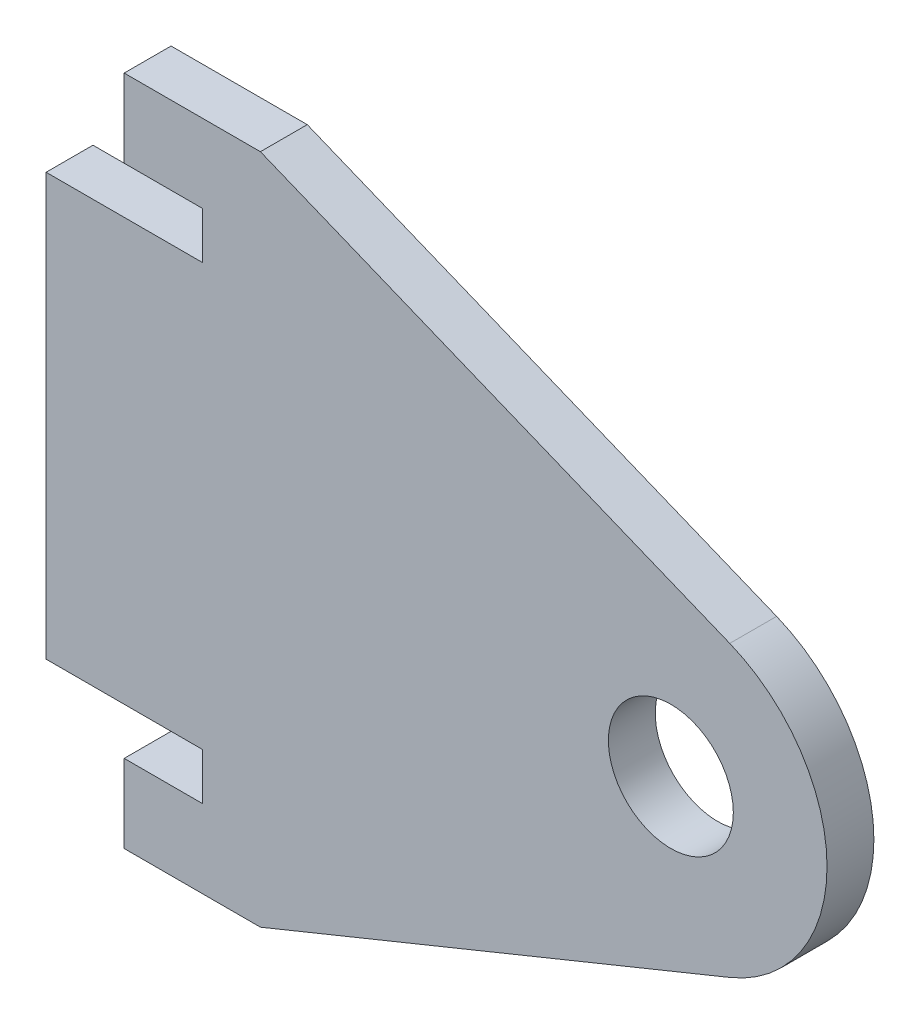
ISO-10303-21;
HEADER;
FILE_DESCRIPTION(('STEP AP214'),'2;1');
FILE_NAME('part.step','',(''),(''),'','','');
FILE_SCHEMA(('AUTOMOTIVE_DESIGN { 1 0 10303 214 1 1 1 1 }'));
ENDSEC;
DATA;
#1=APPLICATION_CONTEXT('core data for automotive mechanical design processes');
#2=APPLICATION_PROTOCOL_DEFINITION('international standard','automotive_design',2000,#1);
#3=PRODUCT_CONTEXT('',#1,'mechanical');
#4=PRODUCT('Part','Part','',(#3));
#5=PRODUCT_RELATED_PRODUCT_CATEGORY('part','',(#4));
#6=PRODUCT_DEFINITION_FORMATION('','',#4);
#7=PRODUCT_DEFINITION_CONTEXT('part definition',#1,'design');
#8=PRODUCT_DEFINITION('design','',#6,#7);
#9=PRODUCT_DEFINITION_SHAPE('','',#8);
#10=(LENGTH_UNIT() NAMED_UNIT(*) SI_UNIT(.MILLI.,.METRE.));
#11=(NAMED_UNIT(*) PLANE_ANGLE_UNIT() SI_UNIT($,.RADIAN.));
#12=(NAMED_UNIT(*) SI_UNIT($,.STERADIAN.) SOLID_ANGLE_UNIT());
#13=UNCERTAINTY_MEASURE_WITH_UNIT(LENGTH_MEASURE(1.E-05),#10,'distance_accuracy_value','');
#14=(GEOMETRIC_REPRESENTATION_CONTEXT(3) GLOBAL_UNCERTAINTY_ASSIGNED_CONTEXT((#13)) GLOBAL_UNIT_ASSIGNED_CONTEXT((#10,
#11,#12)) REPRESENTATION_CONTEXT('',''));
#15=CARTESIAN_POINT('',(0.,0.,0.));
#16=DIRECTION('',(0.,0.,1.));
#17=DIRECTION('',(1.,0.,0.));
#18=AXIS2_PLACEMENT_3D('',#15,#16,#17);
#19=CARTESIAN_POINT('',(28.3384615384615,9.98461538461537,3.));
#20=DIRECTION('',(0.,0.,-1.));
#21=DIRECTION('',(-1.,0.,0.));
#22=AXIS2_PLACEMENT_3D('',#19,#20,#21);
#23=PLANE('',#22);
#24=DIRECTION('',(-1.,0.,0.));
#25=VECTOR('',#24,1.);
#26=CARTESIAN_POINT('',(-11.6615384615385,31.4846153846154,3.));
#27=LINE('',#26,#25);
#28=CARTESIAN_POINT('',(2.05930364072528,31.4846153846154,3.));
#29=VERTEX_POINT('',#28);
#30=CARTESIAN_POINT('',(-6.66153846153847,31.4846153846154,3.));
#31=VERTEX_POINT('',#30);
#32=EDGE_CURVE('E155',#29,#31,#27,.T.);
#33=ORIENTED_EDGE('',*,*,#32,.T.);
#34=DIRECTION('',(0.,1.,0.));
#35=VECTOR('',#34,1.);
#36=CARTESIAN_POINT('',(-6.66153846153847,35.1218574890826,3.));
#37=LINE('',#36,#35);
#38=CARTESIAN_POINT('',(-6.66153846153847,26.4846153846154,3.));
#39=VERTEX_POINT('',#38);
#40=EDGE_CURVE('E63',#39,#31,#37,.T.);
#41=ORIENTED_EDGE('',*,*,#40,.F.);
#42=DIRECTION('',(1.,0.,0.));
#43=VECTOR('',#42,1.);
#44=CARTESIAN_POINT('',(-11.6615384615385,26.4846153846154,3.));
#45=LINE('',#44,#43);
#46=CARTESIAN_POINT('',(-1.66153846153847,26.4846153846154,3.));
#47=VERTEX_POINT('',#46);
#48=EDGE_CURVE('E152',#39,#47,#45,.T.);
#49=ORIENTED_EDGE('',*,*,#48,.T.);
#50=DIRECTION('',(0.,-1.,0.));
#51=VECTOR('',#50,1.);
#52=CARTESIAN_POINT('',(-1.66153846153847,26.4846153846154,3.));
#53=LINE('',#52,#51);
#54=CARTESIAN_POINT('',(-1.66153846153847,23.4846153846154,3.));
#55=VERTEX_POINT('',#54);
#56=EDGE_CURVE('E160',#47,#55,#53,.T.);
#57=ORIENTED_EDGE('',*,*,#56,.T.);
#58=DIRECTION('',(-1.,0.,0.));
#59=VECTOR('',#58,1.);
#60=CARTESIAN_POINT('',(-11.6615384615385,23.4846153846154,3.));
#61=LINE('',#60,#59);
#62=CARTESIAN_POINT('',(-11.6615384615385,23.4846153846154,3.));
#63=VERTEX_POINT('',#62);
#64=EDGE_CURVE('E165',#55,#63,#61,.T.);
#65=ORIENTED_EDGE('',*,*,#64,.T.);
#66=DIRECTION('',(0.,-1.,0.));
#67=VECTOR('',#66,1.);
#68=CARTESIAN_POINT('',(-11.6615384615385,23.4846153846154,3.));
#69=LINE('',#68,#67);
#70=CARTESIAN_POINT('',(-11.6615384615385,-3.51538461538463,3.));
#71=VERTEX_POINT('',#70);
#72=EDGE_CURVE('E176',#63,#71,#69,.T.);
#73=ORIENTED_EDGE('',*,*,#72,.T.);
#74=DIRECTION('',(1.,0.,0.));
#75=VECTOR('',#74,1.);
#76=CARTESIAN_POINT('',(-11.6615384615385,-3.51538461538463,3.));
#77=LINE('',#76,#75);
#78=CARTESIAN_POINT('',(-1.66153846153847,-3.51538461538463,3.));
#79=VERTEX_POINT('',#78);
#80=EDGE_CURVE('E179',#71,#79,#77,.T.);
#81=ORIENTED_EDGE('',*,*,#80,.T.);
#82=DIRECTION('',(0.,-1.,0.));
#83=VECTOR('',#82,1.);
#84=CARTESIAN_POINT('',(-1.66153846153847,-3.51538461538463,3.));
#85=LINE('',#84,#83);
#86=CARTESIAN_POINT('',(-1.66153846153847,-6.51538461538463,3.));
#87=VERTEX_POINT('',#86);
#88=EDGE_CURVE('E182',#79,#87,#85,.T.);
#89=ORIENTED_EDGE('',*,*,#88,.T.);
#90=DIRECTION('',(-1.,0.,0.));
#91=VECTOR('',#90,1.);
#92=CARTESIAN_POINT('',(-11.6615384615385,-6.51538461538463,3.));
#93=LINE('',#92,#91);
#94=CARTESIAN_POINT('',(-6.66153846153847,-6.51538461538463,3.));
#95=VERTEX_POINT('',#94);
#96=EDGE_CURVE('E185',#87,#95,#93,.T.);
#97=ORIENTED_EDGE('',*,*,#96,.T.);
#98=DIRECTION('',(0.,1.,0.));
#99=VECTOR('',#98,1.);
#100=CARTESIAN_POINT('',(-6.66153846153847,-15.1526267198519,3.));
#101=LINE('',#100,#99);
#102=CARTESIAN_POINT('',(-6.66153846153847,-11.5153846153846,3.));
#103=VERTEX_POINT('',#102);
#104=EDGE_CURVE('E414',#103,#95,#101,.T.);
#105=ORIENTED_EDGE('',*,*,#104,.F.);
#106=DIRECTION('',(1.,0.,0.));
#107=VECTOR('',#106,1.);
#108=CARTESIAN_POINT('',(-11.6615384615385,-11.5153846153846,3.));
#109=LINE('',#108,#107);
#110=CARTESIAN_POINT('',(2.05930364072528,-11.5153846153846,3.));
#111=VERTEX_POINT('',#110);
#112=EDGE_CURVE('E189',#103,#111,#109,.T.);
#113=ORIENTED_EDGE('',*,*,#112,.T.);
#114=DIRECTION('',(0.926139546237743,0.377181045248231,0.));
#115=VECTOR('',#114,1.);
#116=CARTESIAN_POINT('',(32.1102719909438,0.723219922237943,3.));
#117=LINE('',#116,#115);
#118=CARTESIAN_POINT('',(32.1102719909438,0.723219922237946,3.));
#119=VERTEX_POINT('',#118);
#120=EDGE_CURVE('E192',#111,#119,#117,.T.);
#121=ORIENTED_EDGE('',*,*,#120,.T.);
#122=CARTESIAN_POINT('',(28.3384615384615,9.98461538461537,3.));
#123=DIRECTION('',(0.,0.,1.));
#124=DIRECTION('',(-1.,0.,0.));
#125=AXIS2_PLACEMENT_3D('',#122,#123,#124);
#126=CIRCLE('',#125,10.);
#127=CARTESIAN_POINT('',(32.1102719909438,19.2460108469928,3.));
#128=VERTEX_POINT('',#127);
#129=EDGE_CURVE('E195',#119,#128,#126,.T.);
#130=ORIENTED_EDGE('',*,*,#129,.T.);
#131=DIRECTION('',(-0.926139546237743,0.377181045248231,0.));
#132=VECTOR('',#131,1.);
#133=CARTESIAN_POINT('',(2.05930364072528,31.4846153846154,3.));
#134=LINE('',#133,#132);
#135=EDGE_CURVE('E198',#128,#29,#134,.T.);
#136=ORIENTED_EDGE('',*,*,#135,.T.);
#137=EDGE_LOOP('',(#33,#41,#49,#57,#65,#73,#81,#89,#97,#105,#113,#121,#130,#136));
#138=FACE_BOUND('',#137,.T.);
#139=CARTESIAN_POINT('',(28.3384615384615,9.98461538461537,3.));
#140=DIRECTION('',(0.,0.,1.));
#141=DIRECTION('',(1.,0.,0.));
#142=AXIS2_PLACEMENT_3D('',#139,#140,#141);
#143=CIRCLE('',#142,4.);
#144=CARTESIAN_POINT('',(32.3384615384615,9.98461538461537,3.));
#145=VERTEX_POINT('',#144);
#146=EDGE_CURVE('E208',#145,#145,#143,.T.);
#147=ORIENTED_EDGE('',*,*,#146,.F.);
#148=EDGE_LOOP('',(#147));
#149=FACE_BOUND('',#148,.T.);
#150=ADVANCED_FACE('F39',(#138,#149),#23,.F.);
#151=CARTESIAN_POINT('',(28.3384615384615,9.98461538461537,0.));
#152=DIRECTION('',(0.,0.,-1.));
#153=DIRECTION('',(-1.,0.,0.));
#154=AXIS2_PLACEMENT_3D('',#151,#152,#153);
#155=PLANE('',#154);
#156=DIRECTION('',(0.,1.,0.));
#157=VECTOR('',#156,1.);
#158=CARTESIAN_POINT('',(-6.66153846153847,35.1218574890826,0.));
#159=LINE('',#158,#157);
#160=CARTESIAN_POINT('',(-6.66153846153847,26.4846153846154,0.));
#161=VERTEX_POINT('',#160);
#162=CARTESIAN_POINT('',(-6.66153846153847,31.4846153846154,0.));
#163=VERTEX_POINT('',#162);
#164=EDGE_CURVE('E142',#161,#163,#159,.T.);
#165=ORIENTED_EDGE('',*,*,#164,.T.);
#166=DIRECTION('',(-1.,0.,0.));
#167=VECTOR('',#166,1.);
#168=CARTESIAN_POINT('',(-11.6615384615385,31.4846153846154,0.));
#169=LINE('',#168,#167);
#170=CARTESIAN_POINT('',(2.05930364072528,31.4846153846154,0.));
#171=VERTEX_POINT('',#170);
#172=EDGE_CURVE('E161',#171,#163,#169,.T.);
#173=ORIENTED_EDGE('',*,*,#172,.F.);
#174=DIRECTION('',(-0.926139546237743,0.377181045248231,0.));
#175=VECTOR('',#174,1.);
#176=CARTESIAN_POINT('',(2.05930364072528,31.4846153846154,0.));
#177=LINE('',#176,#175);
#178=CARTESIAN_POINT('',(32.1102719909438,19.2460108469928,0.));
#179=VERTEX_POINT('',#178);
#180=EDGE_CURVE('E168',#179,#171,#177,.T.);
#181=ORIENTED_EDGE('',*,*,#180,.F.);
#182=CARTESIAN_POINT('',(28.3384615384615,9.98461538461537,0.));
#183=DIRECTION('',(0.,0.,1.));
#184=DIRECTION('',(-1.,0.,0.));
#185=AXIS2_PLACEMENT_3D('',#182,#183,#184);
#186=CIRCLE('',#185,10.);
#187=CARTESIAN_POINT('',(32.1102719909438,0.723219922237946,0.));
#188=VERTEX_POINT('',#187);
#189=EDGE_CURVE('E233',#188,#179,#186,.T.);
#190=ORIENTED_EDGE('',*,*,#189,.F.);
#191=DIRECTION('',(0.926139546237743,0.377181045248231,0.));
#192=VECTOR('',#191,1.);
#193=CARTESIAN_POINT('',(32.1102719909438,0.723219922237943,0.));
#194=LINE('',#193,#192);
#195=CARTESIAN_POINT('',(2.05930364072528,-11.5153846153846,0.));
#196=VERTEX_POINT('',#195);
#197=EDGE_CURVE('E230',#196,#188,#194,.T.);
#198=ORIENTED_EDGE('',*,*,#197,.F.);
#199=DIRECTION('',(1.,0.,0.));
#200=VECTOR('',#199,1.);
#201=CARTESIAN_POINT('',(-11.6615384615385,-11.5153846153846,0.));
#202=LINE('',#201,#200);
#203=CARTESIAN_POINT('',(-6.66153846153847,-11.5153846153846,0.));
#204=VERTEX_POINT('',#203);
#205=EDGE_CURVE('E227',#204,#196,#202,.T.);
#206=ORIENTED_EDGE('',*,*,#205,.F.);
#207=DIRECTION('',(0.,1.,0.));
#208=VECTOR('',#207,1.);
#209=CARTESIAN_POINT('',(-6.66153846153847,-15.1526267198519,0.));
#210=LINE('',#209,#208);
#211=CARTESIAN_POINT('',(-6.66153846153847,-6.51538461538463,0.));
#212=VERTEX_POINT('',#211);
#213=EDGE_CURVE('E55',#204,#212,#210,.T.);
#214=ORIENTED_EDGE('',*,*,#213,.T.);
#215=DIRECTION('',(-1.,0.,0.));
#216=VECTOR('',#215,1.);
#217=CARTESIAN_POINT('',(-11.6615384615385,-6.51538461538463,0.));
#218=LINE('',#217,#216);
#219=CARTESIAN_POINT('',(-1.66153846153847,-6.51538461538463,0.));
#220=VERTEX_POINT('',#219);
#221=EDGE_CURVE('E223',#220,#212,#218,.T.);
#222=ORIENTED_EDGE('',*,*,#221,.F.);
#223=DIRECTION('',(0.,-1.,0.));
#224=VECTOR('',#223,1.);
#225=CARTESIAN_POINT('',(-1.66153846153847,-3.51538461538463,0.));
#226=LINE('',#225,#224);
#227=CARTESIAN_POINT('',(-1.66153846153847,-3.51538461538463,0.));
#228=VERTEX_POINT('',#227);
#229=EDGE_CURVE('E220',#228,#220,#226,.T.);
#230=ORIENTED_EDGE('',*,*,#229,.F.);
#231=DIRECTION('',(1.,0.,0.));
#232=VECTOR('',#231,1.);
#233=CARTESIAN_POINT('',(-11.6615384615385,-3.51538461538463,0.));
#234=LINE('',#233,#232);
#235=CARTESIAN_POINT('',(-11.6615384615385,-3.51538461538463,0.));
#236=VERTEX_POINT('',#235);
#237=EDGE_CURVE('E217',#236,#228,#234,.T.);
#238=ORIENTED_EDGE('',*,*,#237,.F.);
#239=DIRECTION('',(0.,-1.,0.));
#240=VECTOR('',#239,1.);
#241=CARTESIAN_POINT('',(-11.6615384615385,23.4846153846154,0.));
#242=LINE('',#241,#240);
#243=CARTESIAN_POINT('',(-11.6615384615385,23.4846153846154,0.));
#244=VERTEX_POINT('',#243);
#245=EDGE_CURVE('E214',#244,#236,#242,.T.);
#246=ORIENTED_EDGE('',*,*,#245,.F.);
#247=DIRECTION('',(-1.,0.,0.));
#248=VECTOR('',#247,1.);
#249=CARTESIAN_POINT('',(-11.6615384615385,23.4846153846154,0.));
#250=LINE('',#249,#248);
#251=CARTESIAN_POINT('',(-1.66153846153847,23.4846153846154,0.));
#252=VERTEX_POINT('',#251);
#253=EDGE_CURVE('E211',#252,#244,#250,.T.);
#254=ORIENTED_EDGE('',*,*,#253,.F.);
#255=DIRECTION('',(0.,-1.,0.));
#256=VECTOR('',#255,1.);
#257=CARTESIAN_POINT('',(-1.66153846153847,26.4846153846154,0.));
#258=LINE('',#257,#256);
#259=CARTESIAN_POINT('',(-1.66153846153847,26.4846153846154,0.));
#260=VERTEX_POINT('',#259);
#261=EDGE_CURVE('E207',#260,#252,#258,.T.);
#262=ORIENTED_EDGE('',*,*,#261,.F.);
#263=DIRECTION('',(1.,0.,0.));
#264=VECTOR('',#263,1.);
#265=CARTESIAN_POINT('',(-11.6615384615385,26.4846153846154,0.));
#266=LINE('',#265,#264);
#267=EDGE_CURVE('E204',#161,#260,#266,.T.);
#268=ORIENTED_EDGE('',*,*,#267,.F.);
#269=EDGE_LOOP('',(#165,#173,#181,#190,#198,#206,#214,#222,#230,#238,#246,#254,#262,#268));
#270=FACE_BOUND('',#269,.T.);
#271=CARTESIAN_POINT('',(28.3384615384615,9.98461538461537,0.));
#272=DIRECTION('',(0.,0.,1.));
#273=DIRECTION('',(1.,0.,0.));
#274=AXIS2_PLACEMENT_3D('',#271,#272,#273);
#275=CIRCLE('',#274,4.);
#276=CARTESIAN_POINT('',(32.3384615384615,9.98461538461537,0.));
#277=VERTEX_POINT('',#276);
#278=EDGE_CURVE('E171',#277,#277,#275,.T.);
#279=ORIENTED_EDGE('',*,*,#278,.T.);
#280=EDGE_LOOP('',(#279));
#281=FACE_BOUND('',#280,.T.);
#282=ADVANCED_FACE('F280',(#270,#281),#155,.T.);
#283=CARTESIAN_POINT('',(-11.6615384615385,26.4846153846154,3.));
#284=DIRECTION('',(0.,1.,0.));
#285=DIRECTION('',(0.,0.,1.));
#286=AXIS2_PLACEMENT_3D('',#283,#284,#285);
#287=PLANE('',#286);
#288=ORIENTED_EDGE('',*,*,#48,.F.);
#289=DIRECTION('',(0.,0.,1.));
#290=VECTOR('',#289,1.);
#291=CARTESIAN_POINT('',(-6.66153846153847,26.4846153846154,-0.00100000000000013));
#292=LINE('',#291,#290);
#293=EDGE_CURVE('E139',#161,#39,#292,.T.);
#294=ORIENTED_EDGE('',*,*,#293,.F.);
#295=ORIENTED_EDGE('',*,*,#267,.T.);
#296=DIRECTION('',(0.,0.,-1.));
#297=VECTOR('',#296,1.);
#298=CARTESIAN_POINT('',(-1.66153846153847,26.4846153846154,3.));
#299=LINE('',#298,#297);
#300=EDGE_CURVE('E11',#47,#260,#299,.T.);
#301=ORIENTED_EDGE('',*,*,#300,.F.);
#302=EDGE_LOOP('',(#288,#294,#295,#301));
#303=FACE_BOUND('',#302,.T.);
#304=ADVANCED_FACE('F41',(#303),#287,.F.);
#305=CARTESIAN_POINT('',(-1.66153846153847,26.4846153846154,3.));
#306=DIRECTION('',(1.,0.,0.));
#307=DIRECTION('',(0.,1.,0.));
#308=AXIS2_PLACEMENT_3D('',#305,#306,#307);
#309=PLANE('',#308);
#310=ORIENTED_EDGE('',*,*,#261,.T.);
#311=DIRECTION('',(0.,0.,-1.));
#312=VECTOR('',#311,1.);
#313=CARTESIAN_POINT('',(-1.66153846153847,23.4846153846154,3.));
#314=LINE('',#313,#312);
#315=EDGE_CURVE('E48',#55,#252,#314,.T.);
#316=ORIENTED_EDGE('',*,*,#315,.F.);
#317=ORIENTED_EDGE('',*,*,#56,.F.);
#318=ORIENTED_EDGE('',*,*,#300,.T.);
#319=EDGE_LOOP('',(#310,#316,#317,#318));
#320=FACE_BOUND('',#319,.T.);
#321=ADVANCED_FACE('F294',(#320),#309,.F.);
#322=CARTESIAN_POINT('',(-11.6615384615385,23.4846153846154,3.));
#323=DIRECTION('',(0.,-1.,0.));
#324=DIRECTION('',(0.,0.,-1.));
#325=AXIS2_PLACEMENT_3D('',#322,#323,#324);
#326=PLANE('',#325);
#327=ORIENTED_EDGE('',*,*,#253,.T.);
#328=DIRECTION('',(0.,0.,-1.));
#329=VECTOR('',#328,1.);
#330=CARTESIAN_POINT('',(-11.6615384615385,23.4846153846154,3.));
#331=LINE('',#330,#329);
#332=EDGE_CURVE('E265',#63,#244,#331,.T.);
#333=ORIENTED_EDGE('',*,*,#332,.F.);
#334=ORIENTED_EDGE('',*,*,#64,.F.);
#335=ORIENTED_EDGE('',*,*,#315,.T.);
#336=EDGE_LOOP('',(#327,#333,#334,#335));
#337=FACE_BOUND('',#336,.T.);
#338=ADVANCED_FACE('F274',(#337),#326,.F.);
#339=CARTESIAN_POINT('',(-11.6615384615385,23.4846153846154,3.));
#340=DIRECTION('',(1.,0.,0.));
#341=DIRECTION('',(0.,1.,0.));
#342=AXIS2_PLACEMENT_3D('',#339,#340,#341);
#343=PLANE('',#342);
#344=ORIENTED_EDGE('',*,*,#245,.T.);
#345=DIRECTION('',(0.,0.,-1.));
#346=VECTOR('',#345,1.);
#347=CARTESIAN_POINT('',(-11.6615384615385,-3.51538461538463,3.));
#348=LINE('',#347,#346);
#349=EDGE_CURVE('E261',#71,#236,#348,.T.);
#350=ORIENTED_EDGE('',*,*,#349,.F.);
#351=ORIENTED_EDGE('',*,*,#72,.F.);
#352=ORIENTED_EDGE('',*,*,#332,.T.);
#353=EDGE_LOOP('',(#344,#350,#351,#352));
#354=FACE_BOUND('',#353,.T.);
#355=ADVANCED_FACE('F286',(#354),#343,.F.);
#356=CARTESIAN_POINT('',(-11.6615384615385,-3.51538461538463,3.));
#357=DIRECTION('',(0.,1.,0.));
#358=DIRECTION('',(-1.,0.,0.));
#359=AXIS2_PLACEMENT_3D('',#356,#357,#358);
#360=PLANE('',#359);
#361=ORIENTED_EDGE('',*,*,#237,.T.);
#362=DIRECTION('',(0.,0.,-1.));
#363=VECTOR('',#362,1.);
#364=CARTESIAN_POINT('',(-1.66153846153847,-3.51538461538463,3.));
#365=LINE('',#364,#363);
#366=EDGE_CURVE('E257',#79,#228,#365,.T.);
#367=ORIENTED_EDGE('',*,*,#366,.F.);
#368=ORIENTED_EDGE('',*,*,#80,.F.);
#369=ORIENTED_EDGE('',*,*,#349,.T.);
#370=EDGE_LOOP('',(#361,#367,#368,#369));
#371=FACE_BOUND('',#370,.T.);
#372=ADVANCED_FACE('F290',(#371),#360,.F.);
#373=CARTESIAN_POINT('',(-1.66153846153847,-3.51538461538463,3.));
#374=DIRECTION('',(1.,0.,0.));
#375=DIRECTION('',(0.,1.,0.));
#376=AXIS2_PLACEMENT_3D('',#373,#374,#375);
#377=PLANE('',#376);
#378=ORIENTED_EDGE('',*,*,#229,.T.);
#379=DIRECTION('',(0.,0.,-1.));
#380=VECTOR('',#379,1.);
#381=CARTESIAN_POINT('',(-1.66153846153847,-6.51538461538463,3.));
#382=LINE('',#381,#380);
#383=EDGE_CURVE('E253',#87,#220,#382,.T.);
#384=ORIENTED_EDGE('',*,*,#383,.F.);
#385=ORIENTED_EDGE('',*,*,#88,.F.);
#386=ORIENTED_EDGE('',*,*,#366,.T.);
#387=EDGE_LOOP('',(#378,#384,#385,#386));
#388=FACE_BOUND('',#387,.T.);
#389=ADVANCED_FACE('F336',(#388),#377,.F.);
#390=CARTESIAN_POINT('',(-11.6615384615385,-6.51538461538463,3.));
#391=DIRECTION('',(0.,-1.,0.));
#392=DIRECTION('',(1.,0.,0.));
#393=AXIS2_PLACEMENT_3D('',#390,#391,#392);
#394=PLANE('',#393);
#395=ORIENTED_EDGE('',*,*,#221,.T.);
#396=DIRECTION('',(0.,0.,-1.));
#397=VECTOR('',#396,1.);
#398=CARTESIAN_POINT('',(-6.66153846153847,-6.51538461538463,-0.00100000000000013));
#399=LINE('',#398,#397);
#400=EDGE_CURVE('E412',#95,#212,#399,.T.);
#401=ORIENTED_EDGE('',*,*,#400,.F.);
#402=ORIENTED_EDGE('',*,*,#96,.F.);
#403=ORIENTED_EDGE('',*,*,#383,.T.);
#404=EDGE_LOOP('',(#395,#401,#402,#403));
#405=FACE_BOUND('',#404,.T.);
#406=ADVANCED_FACE('F332',(#405),#394,.F.);
#407=CARTESIAN_POINT('',(-11.6615384615385,-11.5153846153846,3.));
#408=DIRECTION('',(0.,1.,0.));
#409=DIRECTION('',(0.,0.,1.));
#410=AXIS2_PLACEMENT_3D('',#407,#408,#409);
#411=PLANE('',#410);
#412=ORIENTED_EDGE('',*,*,#112,.F.);
#413=DIRECTION('',(0.,0.,1.));
#414=VECTOR('',#413,1.);
#415=CARTESIAN_POINT('',(-6.66153846153847,-11.5153846153846,-0.00100000000000013));
#416=LINE('',#415,#414);
#417=EDGE_CURVE('E417',#204,#103,#416,.T.);
#418=ORIENTED_EDGE('',*,*,#417,.F.);
#419=ORIENTED_EDGE('',*,*,#205,.T.);
#420=DIRECTION('',(0.,0.,-1.));
#421=VECTOR('',#420,1.);
#422=CARTESIAN_POINT('',(2.05930364072528,-11.5153846153846,3.));
#423=LINE('',#422,#421);
#424=EDGE_CURVE('E249',#111,#196,#423,.T.);
#425=ORIENTED_EDGE('',*,*,#424,.F.);
#426=EDGE_LOOP('',(#412,#418,#419,#425));
#427=FACE_BOUND('',#426,.T.);
#428=ADVANCED_FACE('F328',(#427),#411,.F.);
#429=CARTESIAN_POINT('',(32.1102719909438,0.723219922237943,3.));
#430=DIRECTION('',(-0.377181045248231,0.926139546237743,0.));
#431=DIRECTION('',(-0.926139546237743,-0.377181045248231,0.));
#432=AXIS2_PLACEMENT_3D('',#429,#430,#431);
#433=PLANE('',#432);
#434=ORIENTED_EDGE('',*,*,#197,.T.);
#435=DIRECTION('',(0.,0.,-1.));
#436=VECTOR('',#435,1.);
#437=CARTESIAN_POINT('',(32.1102719909438,0.723219922237946,3.));
#438=LINE('',#437,#436);
#439=EDGE_CURVE('E245',#119,#188,#438,.T.);
#440=ORIENTED_EDGE('',*,*,#439,.F.);
#441=ORIENTED_EDGE('',*,*,#120,.F.);
#442=ORIENTED_EDGE('',*,*,#424,.T.);
#443=EDGE_LOOP('',(#434,#440,#441,#442));
#444=FACE_BOUND('',#443,.T.);
#445=ADVANCED_FACE('F324',(#444),#433,.F.);
#446=CARTESIAN_POINT('',(28.3384615384615,9.98461538461537,3.));
#447=DIRECTION('',(0.,0.,-1.));
#448=DIRECTION('',(-1.,0.,0.));
#449=AXIS2_PLACEMENT_3D('',#446,#447,#448);
#450=CYLINDRICAL_SURFACE('',#449,10.);
#451=ORIENTED_EDGE('',*,*,#189,.T.);
#452=DIRECTION('',(0.,0.,-1.));
#453=VECTOR('',#452,1.);
#454=CARTESIAN_POINT('',(32.1102719909438,19.2460108469928,3.));
#455=LINE('',#454,#453);
#456=EDGE_CURVE('E241',#128,#179,#455,.T.);
#457=ORIENTED_EDGE('',*,*,#456,.F.);
#458=ORIENTED_EDGE('',*,*,#129,.F.);
#459=ORIENTED_EDGE('',*,*,#439,.T.);
#460=EDGE_LOOP('',(#451,#457,#458,#459));
#461=FACE_BOUND('',#460,.T.);
#462=ADVANCED_FACE('F320',(#461),#450,.T.);
#463=CARTESIAN_POINT('',(2.05930364072528,31.4846153846154,3.));
#464=DIRECTION('',(-0.377181045248231,-0.926139546237743,0.));
#465=DIRECTION('',(0.926139546237743,-0.377181045248231,0.));
#466=AXIS2_PLACEMENT_3D('',#463,#464,#465);
#467=PLANE('',#466);
#468=ORIENTED_EDGE('',*,*,#180,.T.);
#469=DIRECTION('',(0.,0.,-1.));
#470=VECTOR('',#469,1.);
#471=CARTESIAN_POINT('',(2.05930364072528,31.4846153846154,3.));
#472=LINE('',#471,#470);
#473=EDGE_CURVE('E203',#29,#171,#472,.T.);
#474=ORIENTED_EDGE('',*,*,#473,.F.);
#475=ORIENTED_EDGE('',*,*,#135,.F.);
#476=ORIENTED_EDGE('',*,*,#456,.T.);
#477=EDGE_LOOP('',(#468,#474,#475,#476));
#478=FACE_BOUND('',#477,.T.);
#479=ADVANCED_FACE('F316',(#478),#467,.F.);
#480=CARTESIAN_POINT('',(-11.6615384615385,31.4846153846154,3.));
#481=DIRECTION('',(0.,-1.,0.));
#482=DIRECTION('',(0.,0.,-1.));
#483=AXIS2_PLACEMENT_3D('',#480,#481,#482);
#484=PLANE('',#483);
#485=ORIENTED_EDGE('',*,*,#172,.T.);
#486=DIRECTION('',(0.,0.,-1.));
#487=VECTOR('',#486,1.);
#488=CARTESIAN_POINT('',(-6.66153846153847,31.4846153846154,-0.00100000000000013));
#489=LINE('',#488,#487);
#490=EDGE_CURVE('E147',#31,#163,#489,.T.);
#491=ORIENTED_EDGE('',*,*,#490,.F.);
#492=ORIENTED_EDGE('',*,*,#32,.F.);
#493=ORIENTED_EDGE('',*,*,#473,.T.);
#494=EDGE_LOOP('',(#485,#491,#492,#493));
#495=FACE_BOUND('',#494,.T.);
#496=ADVANCED_FACE('F313',(#495),#484,.F.);
#497=CARTESIAN_POINT('',(28.3384615384615,9.98461538461537,3.));
#498=DIRECTION('',(0.,0.,-1.));
#499=DIRECTION('',(-1.,0.,0.));
#500=AXIS2_PLACEMENT_3D('',#497,#498,#499);
#501=CYLINDRICAL_SURFACE('',#500,4.);
#502=ORIENTED_EDGE('',*,*,#146,.T.);
#503=EDGE_LOOP('',(#502));
#504=FACE_BOUND('',#503,.T.);
#505=ORIENTED_EDGE('',*,*,#278,.F.);
#506=EDGE_LOOP('',(#505));
#507=FACE_BOUND('',#506,.T.);
#508=ADVANCED_FACE('F310',(#504,#507),#501,.F.);
#509=CARTESIAN_POINT('',(-6.66153846153847,35.1218574890826,-0.00100000000000013));
#510=DIRECTION('',(1.,0.,0.));
#511=DIRECTION('',(0.,1.,0.));
#512=AXIS2_PLACEMENT_3D('',#509,#510,#511);
#513=PLANE('',#512);
#514=ORIENTED_EDGE('',*,*,#293,.T.);
#515=ORIENTED_EDGE('',*,*,#40,.T.);
#516=ORIENTED_EDGE('',*,*,#490,.T.);
#517=ORIENTED_EDGE('',*,*,#164,.F.);
#518=EDGE_LOOP('',(#514,#515,#516,#517));
#519=FACE_BOUND('',#518,.T.);
#520=ADVANCED_FACE('F140',(#519),#513,.F.);
#521=CARTESIAN_POINT('',(-6.66153846153847,-15.1526267198519,-0.00100000000000013));
#522=DIRECTION('',(1.,0.,0.));
#523=DIRECTION('',(0.,1.,0.));
#524=AXIS2_PLACEMENT_3D('',#521,#522,#523);
#525=PLANE('',#524);
#526=ORIENTED_EDGE('',*,*,#400,.T.);
#527=ORIENTED_EDGE('',*,*,#213,.F.);
#528=ORIENTED_EDGE('',*,*,#417,.T.);
#529=ORIENTED_EDGE('',*,*,#104,.T.);
#530=EDGE_LOOP('',(#526,#527,#528,#529));
#531=FACE_BOUND('',#530,.T.);
#532=ADVANCED_FACE('F397',(#531),#525,.F.);
#533=CLOSED_SHELL('',(#150,#282,#304,#321,#338,#355,#372,#389,#406,#428,#445,#462,#479,#496,
#508,#520,#532));
#534=MANIFOLD_SOLID_BREP('B2',#533);
#535=ADVANCED_BREP_SHAPE_REPRESENTATION('',(#18,#534),#14);
#536=SHAPE_DEFINITION_REPRESENTATION(#9,#535);
ENDSEC;
END-ISO-10303-21;
